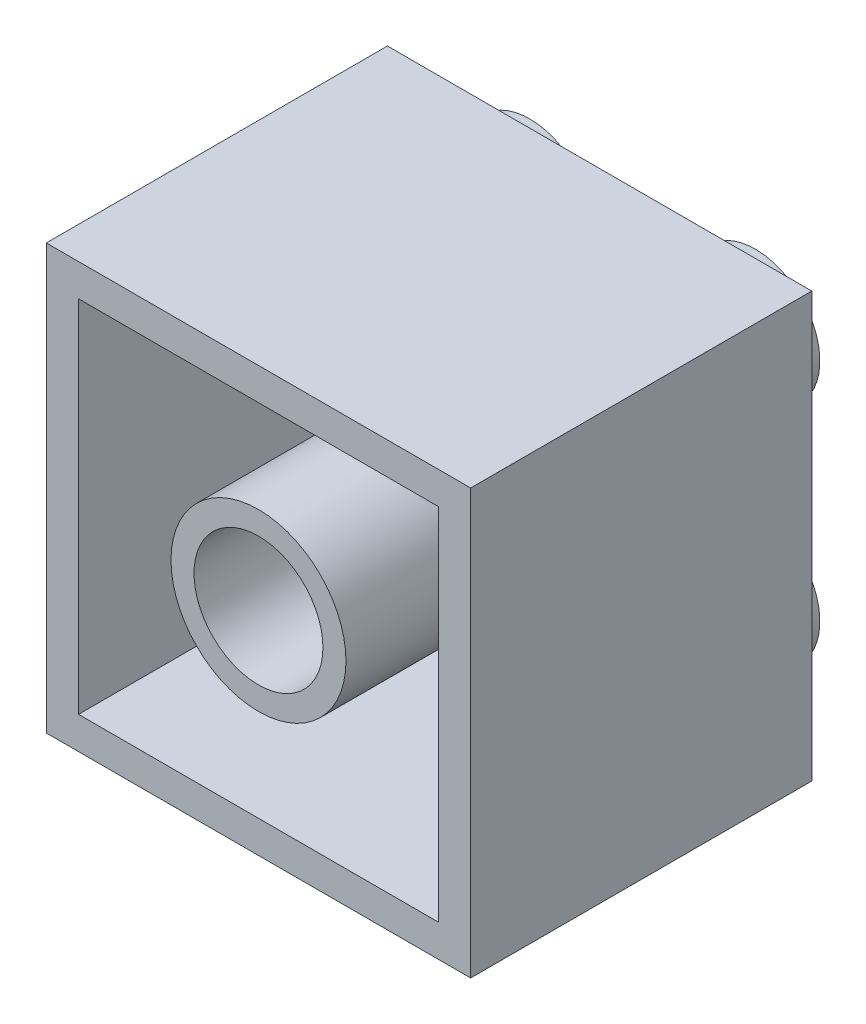
ISO-10303-21;
HEADER;
FILE_DESCRIPTION(('STEP AP214'),'2;1');
FILE_NAME('part.step','',(''),(''),'','','');
FILE_SCHEMA(('AUTOMOTIVE_DESIGN { 1 0 10303 214 1 1 1 1 }'));
ENDSEC;
DATA;
#1=APPLICATION_CONTEXT('core data for automotive mechanical design processes');
#2=APPLICATION_PROTOCOL_DEFINITION('international standard','automotive_design',2000,#1);
#3=PRODUCT_CONTEXT('',#1,'mechanical');
#4=PRODUCT('Part','Part','',(#3));
#5=PRODUCT_RELATED_PRODUCT_CATEGORY('part','',(#4));
#6=PRODUCT_DEFINITION_FORMATION('','',#4);
#7=PRODUCT_DEFINITION_CONTEXT('part definition',#1,'design');
#8=PRODUCT_DEFINITION('design','',#6,#7);
#9=PRODUCT_DEFINITION_SHAPE('','',#8);
#10=(LENGTH_UNIT() NAMED_UNIT(*) SI_UNIT(.MILLI.,.METRE.));
#11=(NAMED_UNIT(*) PLANE_ANGLE_UNIT() SI_UNIT($,.RADIAN.));
#12=(NAMED_UNIT(*) SI_UNIT($,.STERADIAN.) SOLID_ANGLE_UNIT());
#13=UNCERTAINTY_MEASURE_WITH_UNIT(LENGTH_MEASURE(1.E-05),#10,'distance_accuracy_value','');
#14=(GEOMETRIC_REPRESENTATION_CONTEXT(3) GLOBAL_UNCERTAINTY_ASSIGNED_CONTEXT((#13)) GLOBAL_UNIT_ASSIGNED_CONTEXT((#10,
#11,#12)) REPRESENTATION_CONTEXT('',''));
#15=CARTESIAN_POINT('',(0.,0.,0.));
#16=DIRECTION('',(0.,0.,1.));
#17=DIRECTION('',(1.,0.,0.));
#18=AXIS2_PLACEMENT_3D('',#15,#16,#17);
#19=CARTESIAN_POINT('',(0.,0.,1.20000014000004));
#20=DIRECTION('',(0.,0.,-1.));
#21=DIRECTION('',(-1.,0.,0.));
#22=AXIS2_PLACEMENT_3D('',#19,#20,#21);
#23=PLANE('',#22);
#24=CARTESIAN_POINT('',(4.30000000000001,-4.3,1.20000014000004));
#25=DIRECTION('',(0.,0.,1.));
#26=DIRECTION('',(1.,0.,0.));
#27=AXIS2_PLACEMENT_3D('',#24,#25,#26);
#28=CIRCLE('',#27,1.2);
#29=CARTESIAN_POINT('',(5.5,-4.3,1.20000014000004));
#30=VERTEX_POINT('',#29);
#31=EDGE_CURVE('E327',#30,#30,#28,.T.);
#32=ORIENTED_EDGE('',*,*,#31,.F.);
#33=EDGE_LOOP('',(#32));
#34=FACE_BOUND('',#33,.T.);
#35=CARTESIAN_POINT('',(4.30000000000001,4.3,1.20000014000004));
#36=DIRECTION('',(0.,0.,-1.));
#37=DIRECTION('',(-1.,0.,0.));
#38=AXIS2_PLACEMENT_3D('',#35,#36,#37);
#39=CIRCLE('',#38,1.2);
#40=CARTESIAN_POINT('',(3.10000000000001,4.3,1.20000014000004));
#41=VERTEX_POINT('',#40);
#42=EDGE_CURVE('E314',#41,#41,#39,.T.);
#43=ORIENTED_EDGE('',*,*,#42,.T.);
#44=EDGE_LOOP('',(#43));
#45=FACE_BOUND('',#44,.T.);
#46=CARTESIAN_POINT('',(-4.3,-4.3,1.20000014000004));
#47=DIRECTION('',(0.,0.,-1.));
#48=DIRECTION('',(-1.,0.,0.));
#49=AXIS2_PLACEMENT_3D('',#46,#47,#48);
#50=CIRCLE('',#49,1.2);
#51=CARTESIAN_POINT('',(-5.5,-4.3,1.20000014000004));
#52=VERTEX_POINT('',#51);
#53=EDGE_CURVE('E323',#52,#52,#50,.T.);
#54=ORIENTED_EDGE('',*,*,#53,.T.);
#55=EDGE_LOOP('',(#54));
#56=FACE_BOUND('',#55,.T.);
#57=CARTESIAN_POINT('',(0.,0.,1.20000014000004));
#58=DIRECTION('',(0.,0.,-1.));
#59=DIRECTION('',(-1.,0.,0.));
#60=AXIS2_PLACEMENT_3D('',#57,#58,#59);
#61=CIRCLE('',#60,3.25685424949);
#62=CARTESIAN_POINT('',(-3.25685424949,0.,1.20000014000004));
#63=VERTEX_POINT('',#62);
#64=EDGE_CURVE('E447',#63,#63,#61,.F.);
#65=ORIENTED_EDGE('',*,*,#64,.F.);
#66=EDGE_LOOP('',(#65));
#67=FACE_BOUND('',#66,.T.);
#68=DIRECTION('',(-1.,0.,0.));
#69=VECTOR('',#68,1.);
#70=CARTESIAN_POINT('',(6.7,6.7,1.20000014));
#71=LINE('',#70,#69);
#72=CARTESIAN_POINT('',(6.7,6.7,1.20000014));
#73=VERTEX_POINT('',#72);
#74=CARTESIAN_POINT('',(-6.7,6.7,1.20000014));
#75=VERTEX_POINT('',#74);
#76=EDGE_CURVE('E378',#73,#75,#71,.T.);
#77=ORIENTED_EDGE('',*,*,#76,.T.);
#78=DIRECTION('',(0.,-1.,0.));
#79=VECTOR('',#78,1.);
#80=CARTESIAN_POINT('',(-6.7,6.7,1.20000014));
#81=LINE('',#80,#79);
#82=CARTESIAN_POINT('',(-6.7,-6.7,1.20000014));
#83=VERTEX_POINT('',#82);
#84=EDGE_CURVE('E385',#75,#83,#81,.T.);
#85=ORIENTED_EDGE('',*,*,#84,.T.);
#86=DIRECTION('',(1.,0.,0.));
#87=VECTOR('',#86,1.);
#88=CARTESIAN_POINT('',(-6.7,-6.7,1.20000014));
#89=LINE('',#88,#87);
#90=CARTESIAN_POINT('',(6.7,-6.7,1.20000014));
#91=VERTEX_POINT('',#90);
#92=EDGE_CURVE('E367',#83,#91,#89,.T.);
#93=ORIENTED_EDGE('',*,*,#92,.T.);
#94=DIRECTION('',(0.,1.,0.));
#95=VECTOR('',#94,1.);
#96=CARTESIAN_POINT('',(6.7,-6.7,1.20000014));
#97=LINE('',#96,#95);
#98=EDGE_CURVE('E364',#91,#73,#97,.T.);
#99=ORIENTED_EDGE('',*,*,#98,.T.);
#100=EDGE_LOOP('',(#77,#85,#93,#99));
#101=FACE_BOUND('',#100,.T.);
#102=CARTESIAN_POINT('',(-4.3,4.3,1.20000014000004));
#103=DIRECTION('',(0.,0.,1.));
#104=DIRECTION('',(1.,0.,0.));
#105=AXIS2_PLACEMENT_3D('',#102,#103,#104);
#106=CIRCLE('',#105,1.2);
#107=CARTESIAN_POINT('',(-3.1,4.3,1.20000014000004));
#108=VERTEX_POINT('',#107);
#109=EDGE_CURVE('E320',#108,#108,#106,.T.);
#110=ORIENTED_EDGE('',*,*,#109,.F.);
#111=EDGE_LOOP('',(#110));
#112=FACE_BOUND('',#111,.T.);
#113=ADVANCED_FACE('F157',(#34,#45,#56,#67,#101,#112),#23,.F.);
#114=CARTESIAN_POINT('',(0.,0.,0.));
#115=DIRECTION('',(0.,0.,-1.));
#116=DIRECTION('',(-1.,0.,0.));
#117=AXIS2_PLACEMENT_3D('',#114,#115,#116);
#118=PLANE('',#117);
#119=CARTESIAN_POINT('',(-4.2,4.2,0.));
#120=DIRECTION('',(0.,0.,-1.));
#121=DIRECTION('',(-1.,0.,0.));
#122=AXIS2_PLACEMENT_3D('',#119,#120,#121);
#123=CIRCLE('',#122,2.4);
#124=CARTESIAN_POINT('',(-6.6,4.2,0.));
#125=VERTEX_POINT('',#124);
#126=EDGE_CURVE('E340',#125,#125,#123,.T.);
#127=ORIENTED_EDGE('',*,*,#126,.F.);
#128=EDGE_LOOP('',(#127));
#129=FACE_BOUND('',#128,.T.);
#130=CARTESIAN_POINT('',(4.2,4.2,0.));
#131=DIRECTION('',(0.,0.,-1.));
#132=DIRECTION('',(-1.,0.,0.));
#133=AXIS2_PLACEMENT_3D('',#130,#131,#132);
#134=CIRCLE('',#133,2.4);
#135=CARTESIAN_POINT('',(1.8,4.2,0.));
#136=VERTEX_POINT('',#135);
#137=EDGE_CURVE('E14',#136,#136,#134,.T.);
#138=ORIENTED_EDGE('',*,*,#137,.F.);
#139=EDGE_LOOP('',(#138));
#140=FACE_BOUND('',#139,.T.);
#141=CARTESIAN_POINT('',(-4.2,-4.2,0.));
#142=DIRECTION('',(0.,0.,-1.));
#143=DIRECTION('',(-1.,0.,0.));
#144=AXIS2_PLACEMENT_3D('',#141,#142,#143);
#145=CIRCLE('',#144,2.4);
#146=CARTESIAN_POINT('',(-6.6,-4.2,0.));
#147=VERTEX_POINT('',#146);
#148=EDGE_CURVE('E165',#147,#147,#145,.T.);
#149=ORIENTED_EDGE('',*,*,#148,.F.);
#150=EDGE_LOOP('',(#149));
#151=FACE_BOUND('',#150,.T.);
#152=DIRECTION('',(-1.,0.,0.));
#153=VECTOR('',#152,1.);
#154=CARTESIAN_POINT('',(7.9,7.9,0.));
#155=LINE('',#154,#153);
#156=CARTESIAN_POINT('',(7.9,7.9,0.));
#157=VERTEX_POINT('',#156);
#158=CARTESIAN_POINT('',(-7.9,7.9,0.));
#159=VERTEX_POINT('',#158);
#160=EDGE_CURVE('E377',#157,#159,#155,.T.);
#161=ORIENTED_EDGE('',*,*,#160,.F.);
#162=DIRECTION('',(0.,1.,0.));
#163=VECTOR('',#162,1.);
#164=CARTESIAN_POINT('',(7.9,-7.9,0.));
#165=LINE('',#164,#163);
#166=CARTESIAN_POINT('',(7.9,-7.9,0.));
#167=VERTEX_POINT('',#166);
#168=EDGE_CURVE('E422',#167,#157,#165,.T.);
#169=ORIENTED_EDGE('',*,*,#168,.F.);
#170=DIRECTION('',(1.,0.,0.));
#171=VECTOR('',#170,1.);
#172=CARTESIAN_POINT('',(7.9,-7.9,0.));
#173=LINE('',#172,#171);
#174=CARTESIAN_POINT('',(-7.9,-7.9,0.));
#175=VERTEX_POINT('',#174);
#176=EDGE_CURVE('E433',#175,#167,#173,.T.);
#177=ORIENTED_EDGE('',*,*,#176,.F.);
#178=DIRECTION('',(0.,-1.,0.));
#179=VECTOR('',#178,1.);
#180=CARTESIAN_POINT('',(-7.9,-7.9,0.));
#181=LINE('',#180,#179);
#182=EDGE_CURVE('E431',#159,#175,#181,.T.);
#183=ORIENTED_EDGE('',*,*,#182,.F.);
#184=EDGE_LOOP('',(#161,#169,#177,#183));
#185=FACE_BOUND('',#184,.T.);
#186=CARTESIAN_POINT('',(4.2,-4.2,0.));
#187=DIRECTION('',(0.,0.,-1.));
#188=DIRECTION('',(-1.,0.,0.));
#189=AXIS2_PLACEMENT_3D('',#186,#187,#188);
#190=CIRCLE('',#189,2.4);
#191=CARTESIAN_POINT('',(1.8,-4.2,0.));
#192=VERTEX_POINT('',#191);
#193=EDGE_CURVE('E345',#192,#192,#190,.T.);
#194=ORIENTED_EDGE('',*,*,#193,.F.);
#195=EDGE_LOOP('',(#194));
#196=FACE_BOUND('',#195,.T.);
#197=ADVANCED_FACE('F454',(#129,#140,#151,#185,#196),#118,.T.);
#198=CARTESIAN_POINT('',(0.,0.,12.7));
#199=DIRECTION('',(0.,0.,-1.));
#200=DIRECTION('',(-1.,0.,0.));
#201=AXIS2_PLACEMENT_3D('',#198,#199,#200);
#202=PLANE('',#201);
#203=DIRECTION('',(-1.,0.,0.));
#204=VECTOR('',#203,1.);
#205=CARTESIAN_POINT('',(7.9,7.9,12.7));
#206=LINE('',#205,#204);
#207=CARTESIAN_POINT('',(7.9,7.9,12.7));
#208=VERTEX_POINT('',#207);
#209=CARTESIAN_POINT('',(-7.9,7.9,12.7));
#210=VERTEX_POINT('',#209);
#211=EDGE_CURVE('E418',#208,#210,#206,.T.);
#212=ORIENTED_EDGE('',*,*,#211,.T.);
#213=DIRECTION('',(0.,-1.,0.));
#214=VECTOR('',#213,1.);
#215=CARTESIAN_POINT('',(-7.9,-7.9,12.7));
#216=LINE('',#215,#214);
#217=CARTESIAN_POINT('',(-7.9,-7.9,12.7));
#218=VERTEX_POINT('',#217);
#219=EDGE_CURVE('E421',#210,#218,#216,.T.);
#220=ORIENTED_EDGE('',*,*,#219,.T.);
#221=DIRECTION('',(1.,0.,0.));
#222=VECTOR('',#221,1.);
#223=CARTESIAN_POINT('',(7.9,-7.9,12.7));
#224=LINE('',#223,#222);
#225=CARTESIAN_POINT('',(7.9,-7.9,12.7));
#226=VERTEX_POINT('',#225);
#227=EDGE_CURVE('E424',#218,#226,#224,.T.);
#228=ORIENTED_EDGE('',*,*,#227,.T.);
#229=DIRECTION('',(0.,1.,0.));
#230=VECTOR('',#229,1.);
#231=CARTESIAN_POINT('',(7.9,-7.9,12.7));
#232=LINE('',#231,#230);
#233=EDGE_CURVE('E426',#226,#208,#232,.T.);
#234=ORIENTED_EDGE('',*,*,#233,.T.);
#235=EDGE_LOOP('',(#212,#220,#228,#234));
#236=FACE_BOUND('',#235,.T.);
#237=DIRECTION('',(0.,1.,0.));
#238=VECTOR('',#237,1.);
#239=CARTESIAN_POINT('',(6.7,-6.7,12.7));
#240=LINE('',#239,#238);
#241=CARTESIAN_POINT('',(6.7,-6.7,12.7));
#242=VERTEX_POINT('',#241);
#243=CARTESIAN_POINT('',(6.7,6.7,12.7));
#244=VERTEX_POINT('',#243);
#245=EDGE_CURVE('E180',#242,#244,#240,.T.);
#246=ORIENTED_EDGE('',*,*,#245,.F.);
#247=DIRECTION('',(1.,0.,0.));
#248=VECTOR('',#247,1.);
#249=CARTESIAN_POINT('',(-6.7,-6.7,12.7));
#250=LINE('',#249,#248);
#251=CARTESIAN_POINT('',(-6.7,-6.7,12.7));
#252=VERTEX_POINT('',#251);
#253=EDGE_CURVE('E399',#252,#242,#250,.T.);
#254=ORIENTED_EDGE('',*,*,#253,.F.);
#255=DIRECTION('',(0.,-1.,0.));
#256=VECTOR('',#255,1.);
#257=CARTESIAN_POINT('',(-6.7,6.7,12.7));
#258=LINE('',#257,#256);
#259=CARTESIAN_POINT('',(-6.7,6.7,12.7));
#260=VERTEX_POINT('',#259);
#261=EDGE_CURVE('E384',#260,#252,#258,.T.);
#262=ORIENTED_EDGE('',*,*,#261,.F.);
#263=DIRECTION('',(-1.,0.,0.));
#264=VECTOR('',#263,1.);
#265=CARTESIAN_POINT('',(6.7,6.7,12.7));
#266=LINE('',#265,#264);
#267=EDGE_CURVE('E374',#244,#260,#266,.T.);
#268=ORIENTED_EDGE('',*,*,#267,.F.);
#269=EDGE_LOOP('',(#246,#254,#262,#268));
#270=FACE_BOUND('',#269,.T.);
#271=ADVANCED_FACE('F457',(#236,#270),#202,.F.);
#272=CARTESIAN_POINT('',(7.9,7.9,12.7));
#273=DIRECTION('',(0.,-1.,0.));
#274=DIRECTION('',(0.,0.,-1.));
#275=AXIS2_PLACEMENT_3D('',#272,#273,#274);
#276=PLANE('',#275);
#277=ORIENTED_EDGE('',*,*,#160,.T.);
#278=DIRECTION('',(0.,0.,-1.));
#279=VECTOR('',#278,1.);
#280=CARTESIAN_POINT('',(-7.9,7.9,12.7));
#281=LINE('',#280,#279);
#282=EDGE_CURVE('E444',#210,#159,#281,.T.);
#283=ORIENTED_EDGE('',*,*,#282,.F.);
#284=ORIENTED_EDGE('',*,*,#211,.F.);
#285=DIRECTION('',(0.,0.,-1.));
#286=VECTOR('',#285,1.);
#287=CARTESIAN_POINT('',(7.9,7.9,12.7));
#288=LINE('',#287,#286);
#289=EDGE_CURVE('E428',#208,#157,#288,.T.);
#290=ORIENTED_EDGE('',*,*,#289,.T.);
#291=EDGE_LOOP('',(#277,#283,#284,#290));
#292=FACE_BOUND('',#291,.T.);
#293=ADVANCED_FACE('F159',(#292),#276,.F.);
#294=CARTESIAN_POINT('',(-7.9,-7.9,12.7));
#295=DIRECTION('',(1.,0.,0.));
#296=DIRECTION('',(0.,0.,-1.));
#297=AXIS2_PLACEMENT_3D('',#294,#295,#296);
#298=PLANE('',#297);
#299=DIRECTION('',(0.,0.,1.));
#300=VECTOR('',#299,1.);
#301=CARTESIAN_POINT('',(-7.9,-1.12244315855184,8.35));
#302=LINE('',#301,#300);
#303=CARTESIAN_POINT('',(-7.9,-1.12244315855184,4.35));
#304=VERTEX_POINT('',#303);
#305=CARTESIAN_POINT('',(-7.9,-1.12244315855184,8.35));
#306=VERTEX_POINT('',#305);
#307=EDGE_CURVE('E294',#304,#306,#302,.T.);
#308=ORIENTED_EDGE('',*,*,#307,.F.);
#309=DIRECTION('',(0.,-1.,0.));
#310=VECTOR('',#309,1.);
#311=CARTESIAN_POINT('',(-7.9,-1.12244315855184,4.35));
#312=LINE('',#311,#310);
#313=CARTESIAN_POINT('',(-7.9,-0.322443158551843,4.35));
#314=VERTEX_POINT('',#313);
#315=EDGE_CURVE('E172',#314,#304,#312,.T.);
#316=ORIENTED_EDGE('',*,*,#315,.F.);
#317=DIRECTION('',(0.,0.,-1.));
#318=VECTOR('',#317,1.);
#319=CARTESIAN_POINT('',(-7.9,-0.322443158551843,4.35));
#320=LINE('',#319,#318);
#321=CARTESIAN_POINT('',(-7.9,-0.322443158551843,7.55));
#322=VERTEX_POINT('',#321);
#323=EDGE_CURVE('E280',#322,#314,#320,.T.);
#324=ORIENTED_EDGE('',*,*,#323,.F.);
#325=DIRECTION('',(0.,-1.,0.));
#326=VECTOR('',#325,1.);
#327=CARTESIAN_POINT('',(-7.9,-0.322443158551843,7.55));
#328=LINE('',#327,#326);
#329=CARTESIAN_POINT('',(-7.9,0.877556841448156,7.55));
#330=VERTEX_POINT('',#329);
#331=EDGE_CURVE('E283',#330,#322,#328,.T.);
#332=ORIENTED_EDGE('',*,*,#331,.F.);
#333=DIRECTION('',(0.,0.,-1.));
#334=VECTOR('',#333,1.);
#335=CARTESIAN_POINT('',(-7.9,0.877556841448156,7.55));
#336=LINE('',#335,#334);
#337=CARTESIAN_POINT('',(-7.9,0.877556841448156,8.35));
#338=VERTEX_POINT('',#337);
#339=EDGE_CURVE('E299',#338,#330,#336,.T.);
#340=ORIENTED_EDGE('',*,*,#339,.F.);
#341=DIRECTION('',(0.,1.,0.));
#342=VECTOR('',#341,1.);
#343=CARTESIAN_POINT('',(-7.9,0.877556841448156,8.35));
#344=LINE('',#343,#342);
#345=EDGE_CURVE('E296',#306,#338,#344,.T.);
#346=ORIENTED_EDGE('',*,*,#345,.F.);
#347=EDGE_LOOP('',(#308,#316,#324,#332,#340,#346));
#348=FACE_BOUND('',#347,.T.);
#349=ORIENTED_EDGE('',*,*,#182,.T.);
#350=DIRECTION('',(0.,0.,-1.));
#351=VECTOR('',#350,1.);
#352=CARTESIAN_POINT('',(-7.9,-7.9,12.7));
#353=LINE('',#352,#351);
#354=EDGE_CURVE('E441',#218,#175,#353,.T.);
#355=ORIENTED_EDGE('',*,*,#354,.F.);
#356=ORIENTED_EDGE('',*,*,#219,.F.);
#357=ORIENTED_EDGE('',*,*,#282,.T.);
#358=EDGE_LOOP('',(#349,#355,#356,#357));
#359=FACE_BOUND('',#358,.T.);
#360=ADVANCED_FACE('F535',(#348,#359),#298,.F.);
#361=CARTESIAN_POINT('',(7.9,-7.9,12.7));
#362=DIRECTION('',(0.,1.,0.));
#363=DIRECTION('',(0.,0.,1.));
#364=AXIS2_PLACEMENT_3D('',#361,#362,#363);
#365=PLANE('',#364);
#366=ORIENTED_EDGE('',*,*,#176,.T.);
#367=DIRECTION('',(0.,0.,-1.));
#368=VECTOR('',#367,1.);
#369=CARTESIAN_POINT('',(7.9,-7.9,12.7));
#370=LINE('',#369,#368);
#371=EDGE_CURVE('E438',#226,#167,#370,.T.);
#372=ORIENTED_EDGE('',*,*,#371,.F.);
#373=ORIENTED_EDGE('',*,*,#227,.F.);
#374=ORIENTED_EDGE('',*,*,#354,.T.);
#375=EDGE_LOOP('',(#366,#372,#373,#374));
#376=FACE_BOUND('',#375,.T.);
#377=ADVANCED_FACE('F532',(#376),#365,.F.);
#378=CARTESIAN_POINT('',(7.9,-7.9,12.7));
#379=DIRECTION('',(-1.,0.,0.));
#380=DIRECTION('',(0.,0.,1.));
#381=AXIS2_PLACEMENT_3D('',#378,#379,#380);
#382=PLANE('',#381);
#383=ORIENTED_EDGE('',*,*,#168,.T.);
#384=ORIENTED_EDGE('',*,*,#289,.F.);
#385=ORIENTED_EDGE('',*,*,#233,.F.);
#386=ORIENTED_EDGE('',*,*,#371,.T.);
#387=EDGE_LOOP('',(#383,#384,#385,#386));
#388=FACE_BOUND('',#387,.T.);
#389=ADVANCED_FACE('F528',(#388),#382,.F.);
#390=CARTESIAN_POINT('',(6.7,-6.7,12.7));
#391=DIRECTION('',(-1.,0.,0.));
#392=DIRECTION('',(0.,-1.,0.));
#393=AXIS2_PLACEMENT_3D('',#390,#391,#392);
#394=PLANE('',#393);
#395=ORIENTED_EDGE('',*,*,#98,.F.);
#396=DIRECTION('',(0.,0.,-1.));
#397=VECTOR('',#396,1.);
#398=CARTESIAN_POINT('',(6.7,-6.7,12.7));
#399=LINE('',#398,#397);
#400=EDGE_CURVE('E371',#242,#91,#399,.T.);
#401=ORIENTED_EDGE('',*,*,#400,.F.);
#402=ORIENTED_EDGE('',*,*,#245,.T.);
#403=DIRECTION('',(0.,0.,-1.));
#404=VECTOR('',#403,1.);
#405=CARTESIAN_POINT('',(6.7,6.7,12.7));
#406=LINE('',#405,#404);
#407=EDGE_CURVE('E365',#244,#73,#406,.T.);
#408=ORIENTED_EDGE('',*,*,#407,.T.);
#409=EDGE_LOOP('',(#395,#401,#402,#408));
#410=FACE_BOUND('',#409,.T.);
#411=ADVANCED_FACE('F531',(#410),#394,.T.);
#412=CARTESIAN_POINT('',(-6.7,-6.7,12.7));
#413=DIRECTION('',(0.,1.,0.));
#414=DIRECTION('',(0.,0.,1.));
#415=AXIS2_PLACEMENT_3D('',#412,#413,#414);
#416=PLANE('',#415);
#417=ORIENTED_EDGE('',*,*,#92,.F.);
#418=DIRECTION('',(0.,0.,-1.));
#419=VECTOR('',#418,1.);
#420=CARTESIAN_POINT('',(-6.7,-6.7,12.7));
#421=LINE('',#420,#419);
#422=EDGE_CURVE('E402',#252,#83,#421,.T.);
#423=ORIENTED_EDGE('',*,*,#422,.F.);
#424=ORIENTED_EDGE('',*,*,#253,.T.);
#425=ORIENTED_EDGE('',*,*,#400,.T.);
#426=EDGE_LOOP('',(#417,#423,#424,#425));
#427=FACE_BOUND('',#426,.T.);
#428=ADVANCED_FACE('F567',(#427),#416,.T.);
#429=CARTESIAN_POINT('',(-6.7,6.7,12.7));
#430=DIRECTION('',(1.,0.,0.));
#431=DIRECTION('',(0.,1.,0.));
#432=AXIS2_PLACEMENT_3D('',#429,#430,#431);
#433=PLANE('',#432);
#434=ORIENTED_EDGE('',*,*,#84,.F.);
#435=DIRECTION('',(0.,0.,-1.));
#436=VECTOR('',#435,1.);
#437=CARTESIAN_POINT('',(-6.7,6.7,12.7));
#438=LINE('',#437,#436);
#439=EDGE_CURVE('E381',#260,#75,#438,.T.);
#440=ORIENTED_EDGE('',*,*,#439,.F.);
#441=ORIENTED_EDGE('',*,*,#261,.T.);
#442=ORIENTED_EDGE('',*,*,#422,.T.);
#443=EDGE_LOOP('',(#434,#440,#441,#442));
#444=FACE_BOUND('',#443,.T.);
#445=ADVANCED_FACE('F569',(#444),#433,.T.);
#446=CARTESIAN_POINT('',(6.7,6.7,12.7));
#447=DIRECTION('',(0.,-1.,0.));
#448=DIRECTION('',(1.,0.,0.));
#449=AXIS2_PLACEMENT_3D('',#446,#447,#448);
#450=PLANE('',#449);
#451=ORIENTED_EDGE('',*,*,#76,.F.);
#452=ORIENTED_EDGE('',*,*,#407,.F.);
#453=ORIENTED_EDGE('',*,*,#267,.T.);
#454=ORIENTED_EDGE('',*,*,#439,.T.);
#455=EDGE_LOOP('',(#451,#452,#453,#454));
#456=FACE_BOUND('',#455,.T.);
#457=ADVANCED_FACE('F491',(#456),#450,.T.);
#458=CARTESIAN_POINT('',(0.,0.,12.70000014));
#459=DIRECTION('',(0.,0.,-1.));
#460=DIRECTION('',(-1.,0.,0.));
#461=AXIS2_PLACEMENT_3D('',#458,#459,#460);
#462=CYLINDRICAL_SURFACE('',#461,3.25685424949);
#463=CARTESIAN_POINT('',(0.,0.,12.70000014));
#464=DIRECTION('',(0.,0.,1.));
#465=DIRECTION('',(1.,0.,0.));
#466=AXIS2_PLACEMENT_3D('',#463,#464,#465);
#467=CIRCLE('',#466,3.25685424949);
#468=CARTESIAN_POINT('',(3.25685424949,0.,12.70000014));
#469=VERTEX_POINT('',#468);
#470=EDGE_CURVE('E359',#469,#469,#467,.T.);
#471=ORIENTED_EDGE('',*,*,#470,.F.);
#472=EDGE_LOOP('',(#471));
#473=FACE_BOUND('',#472,.T.);
#474=ORIENTED_EDGE('',*,*,#64,.T.);
#475=EDGE_LOOP('',(#474));
#476=FACE_BOUND('',#475,.T.);
#477=ADVANCED_FACE('F575',(#473,#476),#462,.T.);
#478=CARTESIAN_POINT('',(0.,0.,12.70000014));
#479=DIRECTION('',(0.,0.,1.));
#480=DIRECTION('',(1.,0.,0.));
#481=AXIS2_PLACEMENT_3D('',#478,#479,#480);
#482=PLANE('',#481);
#483=CARTESIAN_POINT('',(0.,0.,12.70000014));
#484=DIRECTION('',(0.,0.,1.));
#485=DIRECTION('',(1.,0.,0.));
#486=AXIS2_PLACEMENT_3D('',#483,#484,#485);
#487=CIRCLE('',#486,2.4);
#488=CARTESIAN_POINT('',(2.4,0.,12.70000014));
#489=VERTEX_POINT('',#488);
#490=EDGE_CURVE('E355',#489,#489,#487,.T.);
#491=ORIENTED_EDGE('',*,*,#490,.F.);
#492=EDGE_LOOP('',(#491));
#493=FACE_BOUND('',#492,.T.);
#494=ORIENTED_EDGE('',*,*,#470,.T.);
#495=EDGE_LOOP('',(#494));
#496=FACE_BOUND('',#495,.T.);
#497=ADVANCED_FACE('F582',(#493,#496),#482,.T.);
#498=CARTESIAN_POINT('',(0.,0.,1.20000014000004));
#499=DIRECTION('',(0.,0.,1.));
#500=DIRECTION('',(1.,0.,0.));
#501=AXIS2_PLACEMENT_3D('',#498,#499,#500);
#502=CYLINDRICAL_SURFACE('',#501,2.4);
#503=CARTESIAN_POINT('',(0.,0.,1.20000014000004));
#504=DIRECTION('',(0.,0.,1.));
#505=DIRECTION('',(1.,0.,0.));
#506=AXIS2_PLACEMENT_3D('',#503,#504,#505);
#507=CIRCLE('',#506,2.4);
#508=CARTESIAN_POINT('',(2.4,0.,1.20000014000004));
#509=VERTEX_POINT('',#508);
#510=EDGE_CURVE('E356',#509,#509,#507,.T.);
#511=ORIENTED_EDGE('',*,*,#510,.F.);
#512=EDGE_LOOP('',(#511));
#513=FACE_BOUND('',#512,.T.);
#514=ORIENTED_EDGE('',*,*,#490,.T.);
#515=EDGE_LOOP('',(#514));
#516=FACE_BOUND('',#515,.T.);
#517=ADVANCED_FACE('F586',(#513,#516),#502,.F.);
#518=CARTESIAN_POINT('',(0.,0.,1.20000014000004));
#519=DIRECTION('',(0.,0.,1.));
#520=DIRECTION('',(1.,0.,0.));
#521=AXIS2_PLACEMENT_3D('',#518,#519,#520);
#522=PLANE('',#521);
#523=ORIENTED_EDGE('',*,*,#510,.T.);
#524=EDGE_LOOP('',(#523));
#525=FACE_BOUND('',#524,.T.);
#526=ADVANCED_FACE('F590',(#525),#522,.T.);
#527=CARTESIAN_POINT('',(-4.2,-4.2,-1.6));
#528=DIRECTION('',(0.,0.,1.));
#529=DIRECTION('',(1.,0.,0.));
#530=AXIS2_PLACEMENT_3D('',#527,#528,#529);
#531=CYLINDRICAL_SURFACE('',#530,2.4);
#532=CARTESIAN_POINT('',(-4.2,-4.2,-1.6));
#533=DIRECTION('',(0.,0.,-1.));
#534=DIRECTION('',(-1.,0.,0.));
#535=AXIS2_PLACEMENT_3D('',#532,#533,#534);
#536=CIRCLE('',#535,2.4);
#537=CARTESIAN_POINT('',(-6.6,-4.2,-1.6));
#538=VERTEX_POINT('',#537);
#539=EDGE_CURVE('E344',#538,#538,#536,.F.);
#540=ORIENTED_EDGE('',*,*,#539,.T.);
#541=EDGE_LOOP('',(#540));
#542=FACE_BOUND('',#541,.T.);
#543=ORIENTED_EDGE('',*,*,#148,.T.);
#544=EDGE_LOOP('',(#543));
#545=FACE_BOUND('',#544,.T.);
#546=ADVANCED_FACE('F452',(#542,#545),#531,.T.);
#547=CARTESIAN_POINT('',(0.,0.,-1.6));
#548=DIRECTION('',(0.,0.,-1.));
#549=DIRECTION('',(-1.,0.,0.));
#550=AXIS2_PLACEMENT_3D('',#547,#548,#549);
#551=PLANE('',#550);
#552=ORIENTED_EDGE('',*,*,#539,.F.);
#553=EDGE_LOOP('',(#552));
#554=FACE_BOUND('',#553,.T.);
#555=ADVANCED_FACE('F597',(#554),#551,.T.);
#556=CARTESIAN_POINT('',(4.2,4.2,-1.6));
#557=DIRECTION('',(0.,0.,1.));
#558=DIRECTION('',(1.,0.,0.));
#559=AXIS2_PLACEMENT_3D('',#556,#557,#558);
#560=CYLINDRICAL_SURFACE('',#559,2.4);
#561=CARTESIAN_POINT('',(4.2,4.2,-1.6));
#562=DIRECTION('',(0.,0.,-1.));
#563=DIRECTION('',(-1.,0.,0.));
#564=AXIS2_PLACEMENT_3D('',#561,#562,#563);
#565=CIRCLE('',#564,2.4);
#566=CARTESIAN_POINT('',(1.8,4.2,-1.6));
#567=VERTEX_POINT('',#566);
#568=EDGE_CURVE('E335',#567,#567,#565,.F.);
#569=ORIENTED_EDGE('',*,*,#568,.T.);
#570=EDGE_LOOP('',(#569));
#571=FACE_BOUND('',#570,.T.);
#572=ORIENTED_EDGE('',*,*,#137,.T.);
#573=EDGE_LOOP('',(#572));
#574=FACE_BOUND('',#573,.T.);
#575=ADVANCED_FACE('F601',(#571,#574),#560,.T.);
#576=CARTESIAN_POINT('',(0.,0.,-1.6));
#577=DIRECTION('',(0.,0.,-1.));
#578=DIRECTION('',(-1.,0.,0.));
#579=AXIS2_PLACEMENT_3D('',#576,#577,#578);
#580=PLANE('',#579);
#581=ORIENTED_EDGE('',*,*,#568,.F.);
#582=EDGE_LOOP('',(#581));
#583=FACE_BOUND('',#582,.T.);
#584=ADVANCED_FACE('F604',(#583),#580,.T.);
#585=CARTESIAN_POINT('',(-4.2,4.2,-1.6));
#586=DIRECTION('',(0.,0.,1.));
#587=DIRECTION('',(1.,0.,0.));
#588=AXIS2_PLACEMENT_3D('',#585,#586,#587);
#589=CYLINDRICAL_SURFACE('',#588,2.4);
#590=CARTESIAN_POINT('',(-4.2,4.2,-1.6));
#591=DIRECTION('',(0.,0.,-1.));
#592=DIRECTION('',(-1.,0.,0.));
#593=AXIS2_PLACEMENT_3D('',#590,#591,#592);
#594=CIRCLE('',#593,2.4);
#595=CARTESIAN_POINT('',(-6.6,4.2,-1.6));
#596=VERTEX_POINT('',#595);
#597=EDGE_CURVE('E348',#596,#596,#594,.T.);
#598=ORIENTED_EDGE('',*,*,#597,.F.);
#599=EDGE_LOOP('',(#598));
#600=FACE_BOUND('',#599,.T.);
#601=ORIENTED_EDGE('',*,*,#126,.T.);
#602=EDGE_LOOP('',(#601));
#603=FACE_BOUND('',#602,.T.);
#604=ADVANCED_FACE('F478',(#600,#603),#589,.T.);
#605=CARTESIAN_POINT('',(0.,0.,-1.6));
#606=DIRECTION('',(0.,0.,-1.));
#607=DIRECTION('',(-1.,0.,0.));
#608=AXIS2_PLACEMENT_3D('',#605,#606,#607);
#609=PLANE('',#608);
#610=ORIENTED_EDGE('',*,*,#597,.T.);
#611=EDGE_LOOP('',(#610));
#612=FACE_BOUND('',#611,.T.);
#613=ADVANCED_FACE('F468',(#612),#609,.T.);
#614=CARTESIAN_POINT('',(4.2,-4.2,-1.6));
#615=DIRECTION('',(0.,0.,1.));
#616=DIRECTION('',(1.,0.,0.));
#617=AXIS2_PLACEMENT_3D('',#614,#615,#616);
#618=CYLINDRICAL_SURFACE('',#617,2.4);
#619=CARTESIAN_POINT('',(4.2,-4.2,-1.6));
#620=DIRECTION('',(0.,0.,-1.));
#621=DIRECTION('',(-1.,0.,0.));
#622=AXIS2_PLACEMENT_3D('',#619,#620,#621);
#623=CIRCLE('',#622,2.4);
#624=CARTESIAN_POINT('',(1.8,-4.2,-1.6));
#625=VERTEX_POINT('',#624);
#626=EDGE_CURVE('E341',#625,#625,#623,.T.);
#627=ORIENTED_EDGE('',*,*,#626,.F.);
#628=EDGE_LOOP('',(#627));
#629=FACE_BOUND('',#628,.T.);
#630=ORIENTED_EDGE('',*,*,#193,.T.);
#631=EDGE_LOOP('',(#630));
#632=FACE_BOUND('',#631,.T.);
#633=ADVANCED_FACE('F465',(#629,#632),#618,.T.);
#634=CARTESIAN_POINT('',(0.,0.,-1.6));
#635=DIRECTION('',(0.,0.,-1.));
#636=DIRECTION('',(-1.,0.,0.));
#637=AXIS2_PLACEMENT_3D('',#634,#635,#636);
#638=PLANE('',#637);
#639=ORIENTED_EDGE('',*,*,#626,.T.);
#640=EDGE_LOOP('',(#639));
#641=FACE_BOUND('',#640,.T.);
#642=ADVANCED_FACE('F467',(#641),#638,.T.);
#643=CARTESIAN_POINT('',(-4.3,-4.3,-0.399999859999959));
#644=DIRECTION('',(0.,0.,1.));
#645=DIRECTION('',(1.,0.,0.));
#646=AXIS2_PLACEMENT_3D('',#643,#644,#645);
#647=CYLINDRICAL_SURFACE('',#646,1.2);
#648=CARTESIAN_POINT('',(-4.3,-4.3,-0.399999859999959));
#649=DIRECTION('',(0.,0.,-1.));
#650=DIRECTION('',(-1.,0.,0.));
#651=AXIS2_PLACEMENT_3D('',#648,#649,#650);
#652=CIRCLE('',#651,1.2);
#653=CARTESIAN_POINT('',(-5.5,-4.3,-0.399999859999959));
#654=VERTEX_POINT('',#653);
#655=EDGE_CURVE('E332',#654,#654,#652,.T.);
#656=ORIENTED_EDGE('',*,*,#655,.T.);
#657=EDGE_LOOP('',(#656));
#658=FACE_BOUND('',#657,.T.);
#659=ORIENTED_EDGE('',*,*,#53,.F.);
#660=EDGE_LOOP('',(#659));
#661=FACE_BOUND('',#660,.T.);
#662=ADVANCED_FACE('F475',(#658,#661),#647,.F.);
#663=CARTESIAN_POINT('',(-4.3,-4.3,-0.399999859999959));
#664=DIRECTION('',(0.,0.,-1.));
#665=DIRECTION('',(-1.,0.,0.));
#666=AXIS2_PLACEMENT_3D('',#663,#664,#665);
#667=PLANE('',#666);
#668=ORIENTED_EDGE('',*,*,#655,.F.);
#669=EDGE_LOOP('',(#668));
#670=FACE_BOUND('',#669,.T.);
#671=ADVANCED_FACE('F624',(#670),#667,.F.);
#672=CARTESIAN_POINT('',(4.30000000000001,4.3,-0.399999859999959));
#673=DIRECTION('',(0.,0.,1.));
#674=DIRECTION('',(1.,0.,0.));
#675=AXIS2_PLACEMENT_3D('',#672,#673,#674);
#676=CYLINDRICAL_SURFACE('',#675,1.2);
#677=CARTESIAN_POINT('',(4.30000000000001,4.3,-0.399999859999959));
#678=DIRECTION('',(0.,0.,-1.));
#679=DIRECTION('',(-1.,0.,0.));
#680=AXIS2_PLACEMENT_3D('',#677,#678,#679);
#681=CIRCLE('',#680,1.2);
#682=CARTESIAN_POINT('',(3.10000000000001,4.3,-0.399999859999959));
#683=VERTEX_POINT('',#682);
#684=EDGE_CURVE('E306',#683,#683,#681,.T.);
#685=ORIENTED_EDGE('',*,*,#684,.T.);
#686=EDGE_LOOP('',(#685));
#687=FACE_BOUND('',#686,.T.);
#688=ORIENTED_EDGE('',*,*,#42,.F.);
#689=EDGE_LOOP('',(#688));
#690=FACE_BOUND('',#689,.T.);
#691=ADVANCED_FACE('F628',(#687,#690),#676,.F.);
#692=CARTESIAN_POINT('',(4.30000000000001,4.3,-0.399999859999959));
#693=DIRECTION('',(0.,0.,-1.));
#694=DIRECTION('',(-1.,0.,0.));
#695=AXIS2_PLACEMENT_3D('',#692,#693,#694);
#696=PLANE('',#695);
#697=ORIENTED_EDGE('',*,*,#684,.F.);
#698=EDGE_LOOP('',(#697));
#699=FACE_BOUND('',#698,.T.);
#700=ADVANCED_FACE('F638',(#699),#696,.F.);
#701=CARTESIAN_POINT('',(4.30000000000001,-4.3,-0.399999859999959));
#702=DIRECTION('',(0.,0.,1.));
#703=DIRECTION('',(1.,0.,0.));
#704=AXIS2_PLACEMENT_3D('',#701,#702,#703);
#705=CYLINDRICAL_SURFACE('',#704,1.2);
#706=CARTESIAN_POINT('',(4.30000000000001,-4.3,-0.399999859999959));
#707=DIRECTION('',(0.,0.,1.));
#708=DIRECTION('',(1.,0.,0.));
#709=AXIS2_PLACEMENT_3D('',#706,#707,#708);
#710=CIRCLE('',#709,1.2);
#711=CARTESIAN_POINT('',(5.5,-4.3,-0.399999859999959));
#712=VERTEX_POINT('',#711);
#713=EDGE_CURVE('E317',#712,#712,#710,.T.);
#714=ORIENTED_EDGE('',*,*,#713,.F.);
#715=EDGE_LOOP('',(#714));
#716=FACE_BOUND('',#715,.T.);
#717=ORIENTED_EDGE('',*,*,#31,.T.);
#718=EDGE_LOOP('',(#717));
#719=FACE_BOUND('',#718,.T.);
#720=ADVANCED_FACE('F634',(#716,#719),#705,.F.);
#721=CARTESIAN_POINT('',(4.30000000000001,-4.3,-0.399999859999959));
#722=DIRECTION('',(0.,0.,1.));
#723=DIRECTION('',(1.,0.,0.));
#724=AXIS2_PLACEMENT_3D('',#721,#722,#723);
#725=PLANE('',#724);
#726=ORIENTED_EDGE('',*,*,#713,.T.);
#727=EDGE_LOOP('',(#726));
#728=FACE_BOUND('',#727,.T.);
#729=ADVANCED_FACE('F630',(#728),#725,.T.);
#730=CARTESIAN_POINT('',(-4.3,4.3,-0.399999859999959));
#731=DIRECTION('',(0.,0.,1.));
#732=DIRECTION('',(1.,0.,0.));
#733=AXIS2_PLACEMENT_3D('',#730,#731,#732);
#734=CYLINDRICAL_SURFACE('',#733,1.2);
#735=CARTESIAN_POINT('',(-4.3,4.3,-0.399999859999959));
#736=DIRECTION('',(0.,0.,1.));
#737=DIRECTION('',(1.,0.,0.));
#738=AXIS2_PLACEMENT_3D('',#735,#736,#737);
#739=CIRCLE('',#738,1.2);
#740=CARTESIAN_POINT('',(-3.1,4.3,-0.399999859999959));
#741=VERTEX_POINT('',#740);
#742=EDGE_CURVE('E324',#741,#741,#739,.T.);
#743=ORIENTED_EDGE('',*,*,#742,.F.);
#744=EDGE_LOOP('',(#743));
#745=FACE_BOUND('',#744,.T.);
#746=ORIENTED_EDGE('',*,*,#109,.T.);
#747=EDGE_LOOP('',(#746));
#748=FACE_BOUND('',#747,.T.);
#749=ADVANCED_FACE('F633',(#745,#748),#734,.F.);
#750=CARTESIAN_POINT('',(-4.3,4.3,-0.399999859999959));
#751=DIRECTION('',(0.,0.,1.));
#752=DIRECTION('',(1.,0.,0.));
#753=AXIS2_PLACEMENT_3D('',#750,#751,#752);
#754=PLANE('',#753);
#755=ORIENTED_EDGE('',*,*,#742,.T.);
#756=EDGE_LOOP('',(#755));
#757=FACE_BOUND('',#756,.T.);
#758=ADVANCED_FACE('F640',(#757),#754,.T.);
#759=CARTESIAN_POINT('',(-7.5,-1.12244315855184,4.35));
#760=DIRECTION('',(0.,0.,-1.));
#761=DIRECTION('',(-1.,0.,0.));
#762=AXIS2_PLACEMENT_3D('',#759,#760,#761);
#763=PLANE('',#762);
#764=ORIENTED_EDGE('',*,*,#315,.T.);
#765=DIRECTION('',(-1.,0.,0.));
#766=VECTOR('',#765,1.);
#767=CARTESIAN_POINT('',(-7.5,-1.12244315855184,4.35));
#768=LINE('',#767,#766);
#769=CARTESIAN_POINT('',(-7.5,-1.12244315855184,4.35));
#770=VERTEX_POINT('',#769);
#771=EDGE_CURVE('E257',#770,#304,#768,.T.);
#772=ORIENTED_EDGE('',*,*,#771,.F.);
#773=DIRECTION('',(0.,-1.,0.));
#774=VECTOR('',#773,1.);
#775=CARTESIAN_POINT('',(-7.5,-1.12244315855184,4.35));
#776=LINE('',#775,#774);
#777=CARTESIAN_POINT('',(-7.5,-0.322443158551843,4.35));
#778=VERTEX_POINT('',#777);
#779=EDGE_CURVE('E261',#778,#770,#776,.T.);
#780=ORIENTED_EDGE('',*,*,#779,.F.);
#781=DIRECTION('',(-1.,0.,0.));
#782=VECTOR('',#781,1.);
#783=CARTESIAN_POINT('',(-7.5,-0.322443158551843,4.35));
#784=LINE('',#783,#782);
#785=EDGE_CURVE('E304',#778,#314,#784,.T.);
#786=ORIENTED_EDGE('',*,*,#785,.T.);
#787=EDGE_LOOP('',(#764,#772,#780,#786));
#788=FACE_BOUND('',#787,.T.);
#789=ADVANCED_FACE('F259',(#788),#763,.F.);
#790=CARTESIAN_POINT('',(-7.5,-0.322443158551843,4.35));
#791=DIRECTION('',(0.,1.,0.));
#792=DIRECTION('',(0.,0.,1.));
#793=AXIS2_PLACEMENT_3D('',#790,#791,#792);
#794=PLANE('',#793);
#795=ORIENTED_EDGE('',*,*,#323,.T.);
#796=ORIENTED_EDGE('',*,*,#785,.F.);
#797=DIRECTION('',(0.,0.,-1.));
#798=VECTOR('',#797,1.);
#799=CARTESIAN_POINT('',(-7.5,-0.322443158551843,4.35));
#800=LINE('',#799,#798);
#801=CARTESIAN_POINT('',(-7.5,-0.322443158551843,7.55));
#802=VERTEX_POINT('',#801);
#803=EDGE_CURVE('E267',#802,#778,#800,.T.);
#804=ORIENTED_EDGE('',*,*,#803,.F.);
#805=DIRECTION('',(-1.,0.,0.));
#806=VECTOR('',#805,1.);
#807=CARTESIAN_POINT('',(-7.5,-0.322443158551843,7.55));
#808=LINE('',#807,#806);
#809=EDGE_CURVE('E307',#802,#322,#808,.T.);
#810=ORIENTED_EDGE('',*,*,#809,.T.);
#811=EDGE_LOOP('',(#795,#796,#804,#810));
#812=FACE_BOUND('',#811,.T.);
#813=ADVANCED_FACE('F653',(#812),#794,.F.);
#814=CARTESIAN_POINT('',(-7.5,-0.322443158551843,7.55));
#815=DIRECTION('',(0.,0.,-1.));
#816=DIRECTION('',(-1.,0.,0.));
#817=AXIS2_PLACEMENT_3D('',#814,#815,#816);
#818=PLANE('',#817);
#819=ORIENTED_EDGE('',*,*,#331,.T.);
#820=ORIENTED_EDGE('',*,*,#809,.F.);
#821=DIRECTION('',(0.,-1.,0.));
#822=VECTOR('',#821,1.);
#823=CARTESIAN_POINT('',(-7.5,-0.322443158551843,7.55));
#824=LINE('',#823,#822);
#825=CARTESIAN_POINT('',(-7.5,0.877556841448156,7.55));
#826=VERTEX_POINT('',#825);
#827=EDGE_CURVE('E290',#826,#802,#824,.T.);
#828=ORIENTED_EDGE('',*,*,#827,.F.);
#829=DIRECTION('',(-1.,0.,0.));
#830=VECTOR('',#829,1.);
#831=CARTESIAN_POINT('',(-7.5,0.877556841448156,7.55));
#832=LINE('',#831,#830);
#833=EDGE_CURVE('E309',#826,#330,#832,.T.);
#834=ORIENTED_EDGE('',*,*,#833,.T.);
#835=EDGE_LOOP('',(#819,#820,#828,#834));
#836=FACE_BOUND('',#835,.T.);
#837=ADVANCED_FACE('F663',(#836),#818,.F.);
#838=CARTESIAN_POINT('',(-7.5,0.877556841448156,7.55));
#839=DIRECTION('',(0.,1.,0.));
#840=DIRECTION('',(0.,0.,1.));
#841=AXIS2_PLACEMENT_3D('',#838,#839,#840);
#842=PLANE('',#841);
#843=ORIENTED_EDGE('',*,*,#339,.T.);
#844=ORIENTED_EDGE('',*,*,#833,.F.);
#845=DIRECTION('',(0.,0.,-1.));
#846=VECTOR('',#845,1.);
#847=CARTESIAN_POINT('',(-7.5,0.877556841448156,7.55));
#848=LINE('',#847,#846);
#849=CARTESIAN_POINT('',(-7.5,0.877556841448156,8.35));
#850=VERTEX_POINT('',#849);
#851=EDGE_CURVE('E287',#850,#826,#848,.T.);
#852=ORIENTED_EDGE('',*,*,#851,.F.);
#853=DIRECTION('',(-1.,0.,0.));
#854=VECTOR('',#853,1.);
#855=CARTESIAN_POINT('',(-7.5,0.877556841448156,8.35));
#856=LINE('',#855,#854);
#857=EDGE_CURVE('E311',#850,#338,#856,.T.);
#858=ORIENTED_EDGE('',*,*,#857,.T.);
#859=EDGE_LOOP('',(#843,#844,#852,#858));
#860=FACE_BOUND('',#859,.T.);
#861=ADVANCED_FACE('F659',(#860),#842,.F.);
#862=CARTESIAN_POINT('',(-7.5,0.877556841448156,8.35));
#863=DIRECTION('',(0.,0.,1.));
#864=DIRECTION('',(1.,0.,0.));
#865=AXIS2_PLACEMENT_3D('',#862,#863,#864);
#866=PLANE('',#865);
#867=ORIENTED_EDGE('',*,*,#345,.T.);
#868=ORIENTED_EDGE('',*,*,#857,.F.);
#869=DIRECTION('',(0.,1.,0.));
#870=VECTOR('',#869,1.);
#871=CARTESIAN_POINT('',(-7.5,0.877556841448156,8.35));
#872=LINE('',#871,#870);
#873=CARTESIAN_POINT('',(-7.5,-1.12244315855184,8.35));
#874=VERTEX_POINT('',#873);
#875=EDGE_CURVE('E275',#874,#850,#872,.T.);
#876=ORIENTED_EDGE('',*,*,#875,.F.);
#877=DIRECTION('',(-1.,0.,0.));
#878=VECTOR('',#877,1.);
#879=CARTESIAN_POINT('',(-7.5,-1.12244315855184,8.35));
#880=LINE('',#879,#878);
#881=EDGE_CURVE('E266',#874,#306,#880,.T.);
#882=ORIENTED_EDGE('',*,*,#881,.T.);
#883=EDGE_LOOP('',(#867,#868,#876,#882));
#884=FACE_BOUND('',#883,.T.);
#885=ADVANCED_FACE('F656',(#884),#866,.F.);
#886=CARTESIAN_POINT('',(-7.5,-1.12244315855184,8.35));
#887=DIRECTION('',(0.,-1.,0.));
#888=DIRECTION('',(0.,0.,-1.));
#889=AXIS2_PLACEMENT_3D('',#886,#887,#888);
#890=PLANE('',#889);
#891=ORIENTED_EDGE('',*,*,#307,.T.);
#892=ORIENTED_EDGE('',*,*,#881,.F.);
#893=DIRECTION('',(0.,0.,1.));
#894=VECTOR('',#893,1.);
#895=CARTESIAN_POINT('',(-7.5,-1.12244315855184,8.35));
#896=LINE('',#895,#894);
#897=EDGE_CURVE('E270',#770,#874,#896,.T.);
#898=ORIENTED_EDGE('',*,*,#897,.F.);
#899=ORIENTED_EDGE('',*,*,#771,.T.);
#900=EDGE_LOOP('',(#891,#892,#898,#899));
#901=FACE_BOUND('',#900,.T.);
#902=ADVANCED_FACE('F271',(#901),#890,.F.);
#903=CARTESIAN_POINT('',(-7.5,0.,0.));
#904=DIRECTION('',(1.,0.,0.));
#905=DIRECTION('',(0.,0.,-1.));
#906=AXIS2_PLACEMENT_3D('',#903,#904,#905);
#907=PLANE('',#906);
#908=ORIENTED_EDGE('',*,*,#779,.T.);
#909=ORIENTED_EDGE('',*,*,#897,.T.);
#910=ORIENTED_EDGE('',*,*,#875,.T.);
#911=ORIENTED_EDGE('',*,*,#851,.T.);
#912=ORIENTED_EDGE('',*,*,#827,.T.);
#913=ORIENTED_EDGE('',*,*,#803,.T.);
#914=EDGE_LOOP('',(#908,#909,#910,#911,#912,#913));
#915=FACE_BOUND('',#914,.T.);
#916=ADVANCED_FACE('F277',(#915),#907,.F.);
#917=CLOSED_SHELL('',(#113,#197,#271,#293,#360,#377,#389,#411,#428,#445,#457,#477,#497,#517,
#526,#546,#555,#575,#584,#604,#613,#633,#642,#662,#671,#691,#700,#720,#729,#749,#758,#789,#813,
#837,#861,#885,#902,#916));
#918=MANIFOLD_SOLID_BREP('B2',#917);
#919=ADVANCED_BREP_SHAPE_REPRESENTATION('',(#18,#918),#14);
#920=SHAPE_DEFINITION_REPRESENTATION(#9,#919);
ENDSEC;
END-ISO-10303-21;
